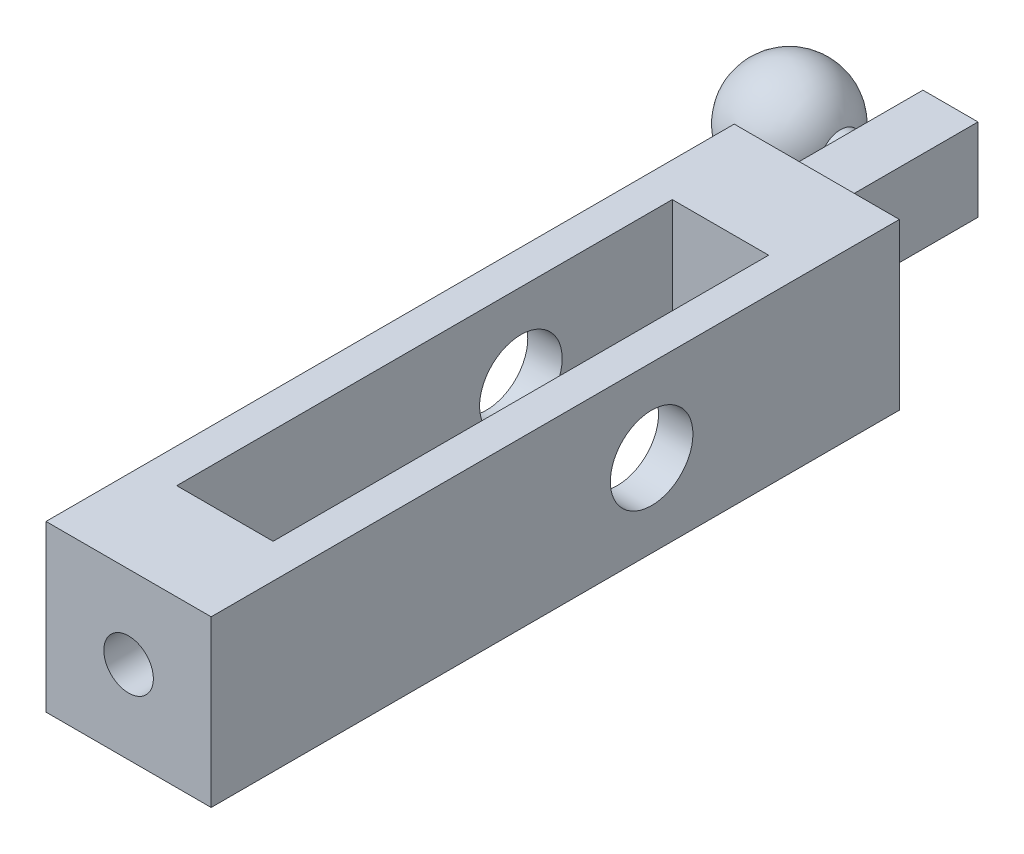
ISO-10303-21;
HEADER;
FILE_DESCRIPTION(('STEP AP214'),'2;1');
FILE_NAME('part.step','',(''),(''),'','','');
FILE_SCHEMA(('AUTOMOTIVE_DESIGN { 1 0 10303 214 1 1 1 1 }'));
ENDSEC;
DATA;
#1=APPLICATION_CONTEXT('core data for automotive mechanical design processes');
#2=APPLICATION_PROTOCOL_DEFINITION('international standard','automotive_design',2000,#1);
#3=PRODUCT_CONTEXT('',#1,'mechanical');
#4=PRODUCT('Part','Part','',(#3));
#5=PRODUCT_RELATED_PRODUCT_CATEGORY('part','',(#4));
#6=PRODUCT_DEFINITION_FORMATION('','',#4);
#7=PRODUCT_DEFINITION_CONTEXT('part definition',#1,'design');
#8=PRODUCT_DEFINITION('design','',#6,#7);
#9=PRODUCT_DEFINITION_SHAPE('','',#8);
#10=(LENGTH_UNIT() NAMED_UNIT(*) SI_UNIT(.MILLI.,.METRE.));
#11=(NAMED_UNIT(*) PLANE_ANGLE_UNIT() SI_UNIT($,.RADIAN.));
#12=(NAMED_UNIT(*) SI_UNIT($,.STERADIAN.) SOLID_ANGLE_UNIT());
#13=UNCERTAINTY_MEASURE_WITH_UNIT(LENGTH_MEASURE(1.E-05),#10,'distance_accuracy_value','');
#14=(GEOMETRIC_REPRESENTATION_CONTEXT(3) GLOBAL_UNCERTAINTY_ASSIGNED_CONTEXT((#13)) GLOBAL_UNIT_ASSIGNED_CONTEXT((#10,
#11,#12)) REPRESENTATION_CONTEXT('',''));
#15=CARTESIAN_POINT('',(0.,0.,0.));
#16=DIRECTION('',(0.,0.,1.));
#17=DIRECTION('',(1.,0.,0.));
#18=AXIS2_PLACEMENT_3D('',#15,#16,#17);
#19=CARTESIAN_POINT('',(3.,-3.,-25.));
#20=DIRECTION('',(0.,1.,0.));
#21=DIRECTION('',(-1.,0.,0.));
#22=AXIS2_PLACEMENT_3D('',#19,#20,#21);
#23=PLANE('',#22);
#24=DIRECTION('',(1.,0.,0.));
#25=VECTOR('',#24,1.);
#26=CARTESIAN_POINT('',(3.,-3.,0.));
#27=LINE('',#26,#25);
#28=CARTESIAN_POINT('',(-3.,-3.,0.));
#29=VERTEX_POINT('',#28);
#30=CARTESIAN_POINT('',(3.,-3.,0.));
#31=VERTEX_POINT('',#30);
#32=EDGE_CURVE('E224',#29,#31,#27,.T.);
#33=ORIENTED_EDGE('',*,*,#32,.F.);
#34=DIRECTION('',(0.,0.,1.));
#35=VECTOR('',#34,1.);
#36=CARTESIAN_POINT('',(-3.,-3.,-25.));
#37=LINE('',#36,#35);
#38=CARTESIAN_POINT('',(-3.,-3.,-25.));
#39=VERTEX_POINT('',#38);
#40=EDGE_CURVE('E52',#39,#29,#37,.T.);
#41=ORIENTED_EDGE('',*,*,#40,.F.);
#42=DIRECTION('',(1.,0.,0.));
#43=VECTOR('',#42,1.);
#44=CARTESIAN_POINT('',(3.,-3.,-25.));
#45=LINE('',#44,#43);
#46=CARTESIAN_POINT('',(3.,-3.,-25.));
#47=VERTEX_POINT('',#46);
#48=EDGE_CURVE('E213',#39,#47,#45,.T.);
#49=ORIENTED_EDGE('',*,*,#48,.T.);
#50=DIRECTION('',(0.,0.,1.));
#51=VECTOR('',#50,1.);
#52=CARTESIAN_POINT('',(3.,-3.,-25.));
#53=LINE('',#52,#51);
#54=EDGE_CURVE('E236',#47,#31,#53,.T.);
#55=ORIENTED_EDGE('',*,*,#54,.T.);
#56=EDGE_LOOP('',(#33,#41,#49,#55));
#57=FACE_BOUND('',#56,.T.);
#58=DIRECTION('',(1.,0.,0.));
#59=VECTOR('',#58,1.);
#60=CARTESIAN_POINT('',(3.,-3.,-3.5));
#61=LINE('',#60,#59);
#62=CARTESIAN_POINT('',(-1.75,-3.,-3.5));
#63=VERTEX_POINT('',#62);
#64=CARTESIAN_POINT('',(1.75,-3.,-3.5));
#65=VERTEX_POINT('',#64);
#66=EDGE_CURVE('E174',#63,#65,#61,.T.);
#67=ORIENTED_EDGE('',*,*,#66,.T.);
#68=DIRECTION('',(0.,0.,-1.));
#69=VECTOR('',#68,1.);
#70=CARTESIAN_POINT('',(1.75,-3.,-25.));
#71=LINE('',#70,#69);
#72=CARTESIAN_POINT('',(1.75,-3.,-21.5));
#73=VERTEX_POINT('',#72);
#74=EDGE_CURVE('E142',#65,#73,#71,.T.);
#75=ORIENTED_EDGE('',*,*,#74,.T.);
#76=DIRECTION('',(-1.,0.,0.));
#77=VECTOR('',#76,1.);
#78=CARTESIAN_POINT('',(3.,-3.,-21.5));
#79=LINE('',#78,#77);
#80=CARTESIAN_POINT('',(-1.75,-3.,-21.5));
#81=VERTEX_POINT('',#80);
#82=EDGE_CURVE('E170',#73,#81,#79,.T.);
#83=ORIENTED_EDGE('',*,*,#82,.T.);
#84=DIRECTION('',(0.,0.,1.));
#85=VECTOR('',#84,1.);
#86=CARTESIAN_POINT('',(-1.75,-3.,-25.));
#87=LINE('',#86,#85);
#88=EDGE_CURVE('E144',#81,#63,#87,.T.);
#89=ORIENTED_EDGE('',*,*,#88,.T.);
#90=EDGE_LOOP('',(#67,#75,#83,#89));
#91=FACE_BOUND('',#90,.T.);
#92=ADVANCED_FACE('F43',(#57,#91),#23,.F.);
#93=CARTESIAN_POINT('',(3.,3.,-25.));
#94=DIRECTION('',(0.,-1.,0.));
#95=DIRECTION('',(1.,0.,0.));
#96=AXIS2_PLACEMENT_3D('',#93,#94,#95);
#97=PLANE('',#96);
#98=DIRECTION('',(-1.,0.,0.));
#99=VECTOR('',#98,1.);
#100=CARTESIAN_POINT('',(3.,3.,0.));
#101=LINE('',#100,#99);
#102=CARTESIAN_POINT('',(3.,3.,0.));
#103=VERTEX_POINT('',#102);
#104=CARTESIAN_POINT('',(-3.,3.,0.));
#105=VERTEX_POINT('',#104);
#106=EDGE_CURVE('E214',#103,#105,#101,.T.);
#107=ORIENTED_EDGE('',*,*,#106,.F.);
#108=DIRECTION('',(0.,0.,1.));
#109=VECTOR('',#108,1.);
#110=CARTESIAN_POINT('',(3.,3.,-25.));
#111=LINE('',#110,#109);
#112=CARTESIAN_POINT('',(3.,3.,-25.));
#113=VERTEX_POINT('',#112);
#114=EDGE_CURVE('E233',#113,#103,#111,.T.);
#115=ORIENTED_EDGE('',*,*,#114,.F.);
#116=DIRECTION('',(-1.,0.,0.));
#117=VECTOR('',#116,1.);
#118=CARTESIAN_POINT('',(3.,3.,-25.));
#119=LINE('',#118,#117);
#120=CARTESIAN_POINT('',(-3.,3.,-25.));
#121=VERTEX_POINT('',#120);
#122=EDGE_CURVE('E219',#113,#121,#119,.T.);
#123=ORIENTED_EDGE('',*,*,#122,.T.);
#124=DIRECTION('',(0.,0.,1.));
#125=VECTOR('',#124,1.);
#126=CARTESIAN_POINT('',(-3.,3.,-25.));
#127=LINE('',#126,#125);
#128=EDGE_CURVE('E222',#121,#105,#127,.T.);
#129=ORIENTED_EDGE('',*,*,#128,.T.);
#130=EDGE_LOOP('',(#107,#115,#123,#129));
#131=FACE_BOUND('',#130,.T.);
#132=DIRECTION('',(1.,0.,0.));
#133=VECTOR('',#132,1.);
#134=CARTESIAN_POINT('',(-1.75,3.,-3.5));
#135=LINE('',#134,#133);
#136=CARTESIAN_POINT('',(-1.75,3.,-3.5));
#137=VERTEX_POINT('',#136);
#138=CARTESIAN_POINT('',(1.75,3.,-3.5));
#139=VERTEX_POINT('',#138);
#140=EDGE_CURVE('E151',#137,#139,#135,.T.);
#141=ORIENTED_EDGE('',*,*,#140,.F.);
#142=DIRECTION('',(0.,0.,1.));
#143=VECTOR('',#142,1.);
#144=CARTESIAN_POINT('',(-1.75,3.,-3.5));
#145=LINE('',#144,#143);
#146=CARTESIAN_POINT('',(-1.75,3.,-21.5));
#147=VERTEX_POINT('',#146);
#148=EDGE_CURVE('E163',#147,#137,#145,.T.);
#149=ORIENTED_EDGE('',*,*,#148,.F.);
#150=DIRECTION('',(-1.,0.,0.));
#151=VECTOR('',#150,1.);
#152=CARTESIAN_POINT('',(-1.75,3.,-21.5));
#153=LINE('',#152,#151);
#154=CARTESIAN_POINT('',(1.75,3.,-21.5));
#155=VERTEX_POINT('',#154);
#156=EDGE_CURVE('E152',#155,#147,#153,.T.);
#157=ORIENTED_EDGE('',*,*,#156,.F.);
#158=DIRECTION('',(0.,0.,-1.));
#159=VECTOR('',#158,1.);
#160=CARTESIAN_POINT('',(1.75,3.,-3.5));
#161=LINE('',#160,#159);
#162=EDGE_CURVE('E139',#139,#155,#161,.T.);
#163=ORIENTED_EDGE('',*,*,#162,.F.);
#164=EDGE_LOOP('',(#141,#149,#157,#163));
#165=FACE_BOUND('',#164,.T.);
#166=ADVANCED_FACE('F149',(#131,#165),#97,.F.);
#167=CARTESIAN_POINT('',(0.,0.,-25.));
#168=DIRECTION('',(0.,0.,-1.));
#169=DIRECTION('',(1.,0.,0.));
#170=AXIS2_PLACEMENT_3D('',#167,#168,#169);
#171=PLANE('',#170);
#172=DIRECTION('',(0.,-1.,0.));
#173=VECTOR('',#172,1.);
#174=CARTESIAN_POINT('',(-3.,-3.,-25.));
#175=LINE('',#174,#173);
#176=EDGE_CURVE('E211',#121,#39,#175,.T.);
#177=ORIENTED_EDGE('',*,*,#176,.F.);
#178=ORIENTED_EDGE('',*,*,#122,.F.);
#179=DIRECTION('',(0.,1.,0.));
#180=VECTOR('',#179,1.);
#181=CARTESIAN_POINT('',(3.,-3.,-25.));
#182=LINE('',#181,#180);
#183=EDGE_CURVE('E217',#47,#113,#182,.T.);
#184=ORIENTED_EDGE('',*,*,#183,.F.);
#185=ORIENTED_EDGE('',*,*,#48,.F.);
#186=EDGE_LOOP('',(#177,#178,#184,#185));
#187=FACE_BOUND('',#186,.T.);
#188=DIRECTION('',(-1.,0.,0.));
#189=VECTOR('',#188,1.);
#190=CARTESIAN_POINT('',(-2.14479354998716,1.49545918544692,-25.));
#191=LINE('',#190,#189);
#192=CARTESIAN_POINT('',(-0.144793549987163,1.49545918544692,-25.));
#193=VERTEX_POINT('',#192);
#194=CARTESIAN_POINT('',(-2.14479354998716,1.49545918544692,-25.));
#195=VERTEX_POINT('',#194);
#196=EDGE_CURVE('E195',#193,#195,#191,.T.);
#197=ORIENTED_EDGE('',*,*,#196,.T.);
#198=DIRECTION('',(0.,-1.,0.));
#199=VECTOR('',#198,1.);
#200=CARTESIAN_POINT('',(-2.14479354998716,1.49545918544692,-25.));
#201=LINE('',#200,#199);
#202=CARTESIAN_POINT('',(-2.14479354998716,-1.50454081455308,-25.));
#203=VERTEX_POINT('',#202);
#204=EDGE_CURVE('E198',#195,#203,#201,.T.);
#205=ORIENTED_EDGE('',*,*,#204,.T.);
#206=DIRECTION('',(1.,0.,0.));
#207=VECTOR('',#206,1.);
#208=CARTESIAN_POINT('',(-2.14479354998716,-1.50454081455308,-25.));
#209=LINE('',#208,#207);
#210=CARTESIAN_POINT('',(-0.144793549987163,-1.50454081455308,-25.));
#211=VERTEX_POINT('',#210);
#212=EDGE_CURVE('E184',#203,#211,#209,.T.);
#213=ORIENTED_EDGE('',*,*,#212,.T.);
#214=DIRECTION('',(0.,1.,0.));
#215=VECTOR('',#214,1.);
#216=CARTESIAN_POINT('',(-0.144793549987163,1.49545918544692,-25.));
#217=LINE('',#216,#215);
#218=EDGE_CURVE('E179',#211,#193,#217,.T.);
#219=ORIENTED_EDGE('',*,*,#218,.T.);
#220=EDGE_LOOP('',(#197,#205,#213,#219));
#221=FACE_BOUND('',#220,.T.);
#222=ADVANCED_FACE('F276',(#187,#221),#171,.T.);
#223=CARTESIAN_POINT('',(-3.,-3.,-25.));
#224=DIRECTION('',(1.,0.,0.));
#225=DIRECTION('',(0.,0.,1.));
#226=AXIS2_PLACEMENT_3D('',#223,#224,#225);
#227=PLANE('',#226);
#228=CARTESIAN_POINT('',(-3.,0.,-16.));
#229=DIRECTION('',(1.,0.,0.));
#230=DIRECTION('',(0.,0.,-1.));
#231=AXIS2_PLACEMENT_3D('',#228,#229,#230);
#232=CIRCLE('',#231,1.5);
#233=CARTESIAN_POINT('',(-3.,0.,-17.5));
#234=VERTEX_POINT('',#233);
#235=EDGE_CURVE('E242',#234,#234,#232,.T.);
#236=ORIENTED_EDGE('',*,*,#235,.T.);
#237=EDGE_LOOP('',(#236));
#238=FACE_BOUND('',#237,.T.);
#239=DIRECTION('',(0.,-1.,0.));
#240=VECTOR('',#239,1.);
#241=CARTESIAN_POINT('',(-3.,-3.,0.));
#242=LINE('',#241,#240);
#243=EDGE_CURVE('E210',#105,#29,#242,.T.);
#244=ORIENTED_EDGE('',*,*,#243,.F.);
#245=ORIENTED_EDGE('',*,*,#128,.F.);
#246=ORIENTED_EDGE('',*,*,#176,.T.);
#247=ORIENTED_EDGE('',*,*,#40,.T.);
#248=EDGE_LOOP('',(#244,#245,#246,#247));
#249=FACE_BOUND('',#248,.T.);
#250=ADVANCED_FACE('F45',(#238,#249),#227,.F.);
#251=CARTESIAN_POINT('',(3.,-3.,-25.));
#252=DIRECTION('',(-1.,0.,0.));
#253=DIRECTION('',(0.,0.,-1.));
#254=AXIS2_PLACEMENT_3D('',#251,#252,#253);
#255=PLANE('',#254);
#256=CARTESIAN_POINT('',(3.,0.,-16.));
#257=DIRECTION('',(1.,0.,0.));
#258=DIRECTION('',(0.,0.,-1.));
#259=AXIS2_PLACEMENT_3D('',#256,#257,#258);
#260=CIRCLE('',#259,1.5);
#261=CARTESIAN_POINT('',(3.,0.,-17.5));
#262=VERTEX_POINT('',#261);
#263=EDGE_CURVE('E155',#262,#262,#260,.T.);
#264=ORIENTED_EDGE('',*,*,#263,.F.);
#265=EDGE_LOOP('',(#264));
#266=FACE_BOUND('',#265,.T.);
#267=DIRECTION('',(0.,1.,0.));
#268=VECTOR('',#267,1.);
#269=CARTESIAN_POINT('',(3.,-3.,0.));
#270=LINE('',#269,#268);
#271=EDGE_CURVE('E227',#31,#103,#270,.T.);
#272=ORIENTED_EDGE('',*,*,#271,.F.);
#273=ORIENTED_EDGE('',*,*,#54,.F.);
#274=ORIENTED_EDGE('',*,*,#183,.T.);
#275=ORIENTED_EDGE('',*,*,#114,.T.);
#276=EDGE_LOOP('',(#272,#273,#274,#275));
#277=FACE_BOUND('',#276,.T.);
#278=ADVANCED_FACE('F282',(#266,#277),#255,.F.);
#279=CARTESIAN_POINT('',(0.,0.,0.));
#280=DIRECTION('',(0.,0.,-1.));
#281=DIRECTION('',(1.,0.,0.));
#282=AXIS2_PLACEMENT_3D('',#279,#280,#281);
#283=PLANE('',#282);
#284=CARTESIAN_POINT('',(0.,0.,0.));
#285=DIRECTION('',(0.,0.,-1.));
#286=DIRECTION('',(-1.,0.,0.));
#287=AXIS2_PLACEMENT_3D('',#284,#285,#286);
#288=CIRCLE('',#287,0.9);
#289=CARTESIAN_POINT('',(-0.9,0.,0.));
#290=VERTEX_POINT('',#289);
#291=EDGE_CURVE('E251',#290,#290,#288,.T.);
#292=ORIENTED_EDGE('',*,*,#291,.T.);
#293=EDGE_LOOP('',(#292));
#294=FACE_BOUND('',#293,.T.);
#295=ORIENTED_EDGE('',*,*,#243,.T.);
#296=ORIENTED_EDGE('',*,*,#32,.T.);
#297=ORIENTED_EDGE('',*,*,#271,.T.);
#298=ORIENTED_EDGE('',*,*,#106,.T.);
#299=EDGE_LOOP('',(#295,#296,#297,#298));
#300=FACE_BOUND('',#299,.T.);
#301=ADVANCED_FACE('F256',(#294,#300),#283,.F.);
#302=CARTESIAN_POINT('',(-0.144793549987163,1.49545918544692,-31.));
#303=DIRECTION('',(-1.,0.,0.));
#304=DIRECTION('',(0.,-1.,0.));
#305=AXIS2_PLACEMENT_3D('',#302,#303,#304);
#306=PLANE('',#305);
#307=ORIENTED_EDGE('',*,*,#218,.F.);
#308=DIRECTION('',(0.,0.,1.));
#309=VECTOR('',#308,1.);
#310=CARTESIAN_POINT('',(-0.144793549987163,-1.50454081455308,-31.));
#311=LINE('',#310,#309);
#312=CARTESIAN_POINT('',(-0.144793549987163,-1.50454081455308,-31.));
#313=VERTEX_POINT('',#312);
#314=EDGE_CURVE('E192',#313,#211,#311,.T.);
#315=ORIENTED_EDGE('',*,*,#314,.F.);
#316=DIRECTION('',(0.,1.,0.));
#317=VECTOR('',#316,1.);
#318=CARTESIAN_POINT('',(-0.144793549987163,1.49545918544692,-31.));
#319=LINE('',#318,#317);
#320=CARTESIAN_POINT('',(-0.144793549987163,1.49545918544692,-31.));
#321=VERTEX_POINT('',#320);
#322=EDGE_CURVE('E180',#313,#321,#319,.T.);
#323=ORIENTED_EDGE('',*,*,#322,.T.);
#324=DIRECTION('',(0.,0.,1.));
#325=VECTOR('',#324,1.);
#326=CARTESIAN_POINT('',(-0.144793549987163,1.49545918544692,-31.));
#327=LINE('',#326,#325);
#328=EDGE_CURVE('E208',#321,#193,#327,.T.);
#329=ORIENTED_EDGE('',*,*,#328,.T.);
#330=EDGE_LOOP('',(#307,#315,#323,#329));
#331=FACE_BOUND('',#330,.T.);
#332=ADVANCED_FACE('F288',(#331),#306,.F.);
#333=CARTESIAN_POINT('',(-2.14479354998716,1.49545918544692,-31.));
#334=DIRECTION('',(0.,-1.,0.));
#335=DIRECTION('',(1.,0.,0.));
#336=AXIS2_PLACEMENT_3D('',#333,#334,#335);
#337=PLANE('',#336);
#338=ORIENTED_EDGE('',*,*,#196,.F.);
#339=ORIENTED_EDGE('',*,*,#328,.F.);
#340=DIRECTION('',(-1.,0.,0.));
#341=VECTOR('',#340,1.);
#342=CARTESIAN_POINT('',(-2.14479354998716,1.49545918544692,-31.));
#343=LINE('',#342,#341);
#344=CARTESIAN_POINT('',(-2.14479354998716,1.49545918544692,-31.));
#345=VERTEX_POINT('',#344);
#346=EDGE_CURVE('E183',#321,#345,#343,.T.);
#347=ORIENTED_EDGE('',*,*,#346,.T.);
#348=DIRECTION('',(0.,0.,1.));
#349=VECTOR('',#348,1.);
#350=CARTESIAN_POINT('',(-2.14479354998716,1.49545918544692,-31.));
#351=LINE('',#350,#349);
#352=EDGE_CURVE('E206',#345,#195,#351,.T.);
#353=ORIENTED_EDGE('',*,*,#352,.T.);
#354=EDGE_LOOP('',(#338,#339,#347,#353));
#355=FACE_BOUND('',#354,.T.);
#356=ADVANCED_FACE('F294',(#355),#337,.F.);
#357=CARTESIAN_POINT('',(-2.14479354998716,1.49545918544692,-31.));
#358=DIRECTION('',(1.,0.,0.));
#359=DIRECTION('',(0.,1.,0.));
#360=AXIS2_PLACEMENT_3D('',#357,#358,#359);
#361=PLANE('',#360);
#362=CARTESIAN_POINT('',(-2.14479354998716,0.,-29.));
#363=DIRECTION('',(-1.,0.,0.));
#364=DIRECTION('',(0.,1.,0.));
#365=AXIS2_PLACEMENT_3D('',#362,#363,#364);
#366=CIRCLE('',#365,0.750000000000002);
#367=CARTESIAN_POINT('',(-2.14479354998716,0.750000000000002,-29.));
#368=VERTEX_POINT('',#367);
#369=EDGE_CURVE('E11',#368,#368,#366,.F.);
#370=ORIENTED_EDGE('',*,*,#369,.T.);
#371=EDGE_LOOP('',(#370));
#372=FACE_BOUND('',#371,.T.);
#373=ORIENTED_EDGE('',*,*,#204,.F.);
#374=ORIENTED_EDGE('',*,*,#352,.F.);
#375=DIRECTION('',(0.,-1.,0.));
#376=VECTOR('',#375,1.);
#377=CARTESIAN_POINT('',(-2.14479354998716,1.49545918544692,-31.));
#378=LINE('',#377,#376);
#379=CARTESIAN_POINT('',(-2.14479354998716,-1.50454081455308,-31.));
#380=VERTEX_POINT('',#379);
#381=EDGE_CURVE('E187',#345,#380,#378,.T.);
#382=ORIENTED_EDGE('',*,*,#381,.T.);
#383=DIRECTION('',(0.,0.,1.));
#384=VECTOR('',#383,1.);
#385=CARTESIAN_POINT('',(-2.14479354998716,-1.50454081455308,-31.));
#386=LINE('',#385,#384);
#387=EDGE_CURVE('E204',#380,#203,#386,.T.);
#388=ORIENTED_EDGE('',*,*,#387,.T.);
#389=EDGE_LOOP('',(#373,#374,#382,#388));
#390=FACE_BOUND('',#389,.T.);
#391=ADVANCED_FACE('F298',(#372,#390),#361,.F.);
#392=CARTESIAN_POINT('',(-2.14479354998716,-1.50454081455308,-31.));
#393=DIRECTION('',(0.,1.,0.));
#394=DIRECTION('',(-1.,0.,0.));
#395=AXIS2_PLACEMENT_3D('',#392,#393,#394);
#396=PLANE('',#395);
#397=ORIENTED_EDGE('',*,*,#212,.F.);
#398=ORIENTED_EDGE('',*,*,#387,.F.);
#399=DIRECTION('',(1.,0.,0.));
#400=VECTOR('',#399,1.);
#401=CARTESIAN_POINT('',(-2.14479354998716,-1.50454081455308,-31.));
#402=LINE('',#401,#400);
#403=EDGE_CURVE('E190',#380,#313,#402,.T.);
#404=ORIENTED_EDGE('',*,*,#403,.T.);
#405=ORIENTED_EDGE('',*,*,#314,.T.);
#406=EDGE_LOOP('',(#397,#398,#404,#405));
#407=FACE_BOUND('',#406,.T.);
#408=ADVANCED_FACE('F302',(#407),#396,.F.);
#409=CARTESIAN_POINT('',(0.,0.,-31.));
#410=DIRECTION('',(0.,0.,-1.));
#411=DIRECTION('',(1.,0.,0.));
#412=AXIS2_PLACEMENT_3D('',#409,#410,#411);
#413=PLANE('',#412);
#414=ORIENTED_EDGE('',*,*,#322,.F.);
#415=ORIENTED_EDGE('',*,*,#403,.F.);
#416=ORIENTED_EDGE('',*,*,#381,.F.);
#417=ORIENTED_EDGE('',*,*,#346,.F.);
#418=EDGE_LOOP('',(#414,#415,#416,#417));
#419=FACE_BOUND('',#418,.T.);
#420=ADVANCED_FACE('F306',(#419),#413,.T.);
#421=CARTESIAN_POINT('',(-3.14479354998716,0.,-29.));
#422=DIRECTION('',(1.,0.,0.));
#423=DIRECTION('',(0.,1.,0.));
#424=AXIS2_PLACEMENT_3D('',#421,#422,#423);
#425=CYLINDRICAL_SURFACE('',#424,0.750000000000002);
#426=CARTESIAN_POINT('',(-3.14479354998716,0.,-29.));
#427=DIRECTION('',(1.,0.,0.));
#428=DIRECTION('',(0.,-1.,0.));
#429=AXIS2_PLACEMENT_3D('',#426,#427,#428);
#430=CIRCLE('',#429,0.750000000000002);
#431=CARTESIAN_POINT('',(-3.14479354998716,-0.750000000000002,-29.));
#432=VERTEX_POINT('',#431);
#433=EDGE_CURVE('E176',#432,#432,#430,.T.);
#434=ORIENTED_EDGE('',*,*,#433,.T.);
#435=EDGE_LOOP('',(#434));
#436=FACE_BOUND('',#435,.T.);
#437=ORIENTED_EDGE('',*,*,#369,.F.);
#438=EDGE_LOOP('',(#437));
#439=FACE_BOUND('',#438,.T.);
#440=ADVANCED_FACE('F310',(#436,#439),#425,.T.);
#441=CARTESIAN_POINT('',(-4.99884317176108,0.,-29.));
#442=DIRECTION('',(1.,0.,0.));
#443=DIRECTION('',(0.,0.,1.));
#444=AXIS2_PLACEMENT_3D('',#441,#442,#443);
#445=SPHERICAL_SURFACE('',#444,2.);
#446=ORIENTED_EDGE('',*,*,#433,.F.);
#447=EDGE_LOOP('',(#446));
#448=FACE_BOUND('',#447,.T.);
#449=ADVANCED_FACE('F314',(#448),#445,.T.);
#450=CARTESIAN_POINT('',(-1.75,-5.,-3.5));
#451=DIRECTION('',(0.,0.,-1.));
#452=DIRECTION('',(1.,0.,0.));
#453=AXIS2_PLACEMENT_3D('',#450,#451,#452);
#454=PLANE('',#453);
#455=CARTESIAN_POINT('',(0.,0.,-3.5));
#456=DIRECTION('',(0.,0.,1.));
#457=DIRECTION('',(1.,0.,0.));
#458=AXIS2_PLACEMENT_3D('',#455,#456,#457);
#459=CIRCLE('',#458,0.9);
#460=CARTESIAN_POINT('',(0.9,0.,-3.5));
#461=VERTEX_POINT('',#460);
#462=EDGE_CURVE('E47',#461,#461,#459,.T.);
#463=ORIENTED_EDGE('',*,*,#462,.T.);
#464=EDGE_LOOP('',(#463));
#465=FACE_BOUND('',#464,.T.);
#466=ORIENTED_EDGE('',*,*,#66,.F.);
#467=DIRECTION('',(0.,1.,0.));
#468=VECTOR('',#467,1.);
#469=CARTESIAN_POINT('',(-1.75,-5.,-3.5));
#470=LINE('',#469,#468);
#471=EDGE_CURVE('E68',#63,#137,#470,.T.);
#472=ORIENTED_EDGE('',*,*,#471,.T.);
#473=ORIENTED_EDGE('',*,*,#140,.T.);
#474=DIRECTION('',(0.,1.,0.));
#475=VECTOR('',#474,1.);
#476=CARTESIAN_POINT('',(1.75,-5.,-3.5));
#477=LINE('',#476,#475);
#478=EDGE_CURVE('E136',#65,#139,#477,.T.);
#479=ORIENTED_EDGE('',*,*,#478,.F.);
#480=EDGE_LOOP('',(#466,#472,#473,#479));
#481=FACE_BOUND('',#480,.T.);
#482=ADVANCED_FACE('F154',(#465,#481),#454,.T.);
#483=CARTESIAN_POINT('',(1.75,-5.,-3.5));
#484=DIRECTION('',(-1.,0.,0.));
#485=DIRECTION('',(0.,-1.,0.));
#486=AXIS2_PLACEMENT_3D('',#483,#484,#485);
#487=PLANE('',#486);
#488=CARTESIAN_POINT('',(1.75,0.,-16.));
#489=DIRECTION('',(1.,0.,0.));
#490=DIRECTION('',(0.,-1.,0.));
#491=AXIS2_PLACEMENT_3D('',#488,#489,#490);
#492=CIRCLE('',#491,1.5);
#493=CARTESIAN_POINT('',(1.75,-1.5,-16.));
#494=VERTEX_POINT('',#493);
#495=EDGE_CURVE('E158',#494,#494,#492,.T.);
#496=ORIENTED_EDGE('',*,*,#495,.T.);
#497=EDGE_LOOP('',(#496));
#498=FACE_BOUND('',#497,.T.);
#499=ORIENTED_EDGE('',*,*,#74,.F.);
#500=ORIENTED_EDGE('',*,*,#478,.T.);
#501=ORIENTED_EDGE('',*,*,#162,.T.);
#502=DIRECTION('',(0.,1.,0.));
#503=VECTOR('',#502,1.);
#504=CARTESIAN_POINT('',(1.75,-5.,-21.5));
#505=LINE('',#504,#503);
#506=EDGE_CURVE('E145',#73,#155,#505,.T.);
#507=ORIENTED_EDGE('',*,*,#506,.F.);
#508=EDGE_LOOP('',(#499,#500,#501,#507));
#509=FACE_BOUND('',#508,.T.);
#510=ADVANCED_FACE('F138',(#498,#509),#487,.T.);
#511=CARTESIAN_POINT('',(-1.75,-5.,-21.5));
#512=DIRECTION('',(0.,0.,1.));
#513=DIRECTION('',(-1.,0.,0.));
#514=AXIS2_PLACEMENT_3D('',#511,#512,#513);
#515=PLANE('',#514);
#516=ORIENTED_EDGE('',*,*,#82,.F.);
#517=ORIENTED_EDGE('',*,*,#506,.T.);
#518=ORIENTED_EDGE('',*,*,#156,.T.);
#519=DIRECTION('',(0.,1.,0.));
#520=VECTOR('',#519,1.);
#521=CARTESIAN_POINT('',(-1.75,-5.,-21.5));
#522=LINE('',#521,#520);
#523=EDGE_CURVE('E60',#81,#147,#522,.T.);
#524=ORIENTED_EDGE('',*,*,#523,.F.);
#525=EDGE_LOOP('',(#516,#517,#518,#524));
#526=FACE_BOUND('',#525,.T.);
#527=ADVANCED_FACE('F324',(#526),#515,.T.);
#528=CARTESIAN_POINT('',(-1.75,-5.,-3.5));
#529=DIRECTION('',(1.,0.,0.));
#530=DIRECTION('',(0.,1.,0.));
#531=AXIS2_PLACEMENT_3D('',#528,#529,#530);
#532=PLANE('',#531);
#533=CARTESIAN_POINT('',(-1.75,0.,-16.));
#534=DIRECTION('',(-1.,0.,0.));
#535=DIRECTION('',(0.,1.,0.));
#536=AXIS2_PLACEMENT_3D('',#533,#534,#535);
#537=CIRCLE('',#536,1.5);
#538=CARTESIAN_POINT('',(-1.75,1.5,-16.));
#539=VERTEX_POINT('',#538);
#540=EDGE_CURVE('E240',#539,#539,#537,.T.);
#541=ORIENTED_EDGE('',*,*,#540,.T.);
#542=EDGE_LOOP('',(#541));
#543=FACE_BOUND('',#542,.T.);
#544=ORIENTED_EDGE('',*,*,#88,.F.);
#545=ORIENTED_EDGE('',*,*,#523,.T.);
#546=ORIENTED_EDGE('',*,*,#148,.T.);
#547=ORIENTED_EDGE('',*,*,#471,.F.);
#548=EDGE_LOOP('',(#544,#545,#546,#547));
#549=FACE_BOUND('',#548,.T.);
#550=ADVANCED_FACE('F328',(#543,#549),#532,.T.);
#551=CARTESIAN_POINT('',(5.,0.,-16.));
#552=DIRECTION('',(-1.,0.,0.));
#553=DIRECTION('',(0.,0.,-1.));
#554=AXIS2_PLACEMENT_3D('',#551,#552,#553);
#555=CYLINDRICAL_SURFACE('',#554,1.5);
#556=ORIENTED_EDGE('',*,*,#540,.F.);
#557=EDGE_LOOP('',(#556));
#558=FACE_BOUND('',#557,.T.);
#559=ORIENTED_EDGE('',*,*,#235,.F.);
#560=EDGE_LOOP('',(#559));
#561=FACE_BOUND('',#560,.T.);
#562=ADVANCED_FACE('F267',(#558,#561),#555,.F.);
#563=ORIENTED_EDGE('',*,*,#495,.F.);
#564=EDGE_LOOP('',(#563));
#565=FACE_BOUND('',#564,.T.);
#566=ORIENTED_EDGE('',*,*,#263,.T.);
#567=EDGE_LOOP('',(#566));
#568=FACE_BOUND('',#567,.T.);
#569=ADVANCED_FACE('F261',(#565,#568),#555,.F.);
#570=CARTESIAN_POINT('',(0.,0.,-8.));
#571=DIRECTION('',(0.,0.,1.));
#572=DIRECTION('',(-1.,0.,0.));
#573=AXIS2_PLACEMENT_3D('',#570,#571,#572);
#574=CYLINDRICAL_SURFACE('',#573,0.9);
#575=ORIENTED_EDGE('',*,*,#462,.F.);
#576=EDGE_LOOP('',(#575));
#577=FACE_BOUND('',#576,.T.);
#578=ORIENTED_EDGE('',*,*,#291,.F.);
#579=EDGE_LOOP('',(#578));
#580=FACE_BOUND('',#579,.T.);
#581=ADVANCED_FACE('F259',(#577,#580),#574,.F.);
#582=CLOSED_SHELL('',(#92,#166,#222,#250,#278,#301,#332,#356,#391,#408,#420,#440,#449,#482,#510,
#527,#550,#562,#569,#581));
#583=MANIFOLD_SOLID_BREP('B2',#582);
#584=ADVANCED_BREP_SHAPE_REPRESENTATION('',(#18,#583),#14);
#585=SHAPE_DEFINITION_REPRESENTATION(#9,#584);
ENDSEC;
END-ISO-10303-21;
